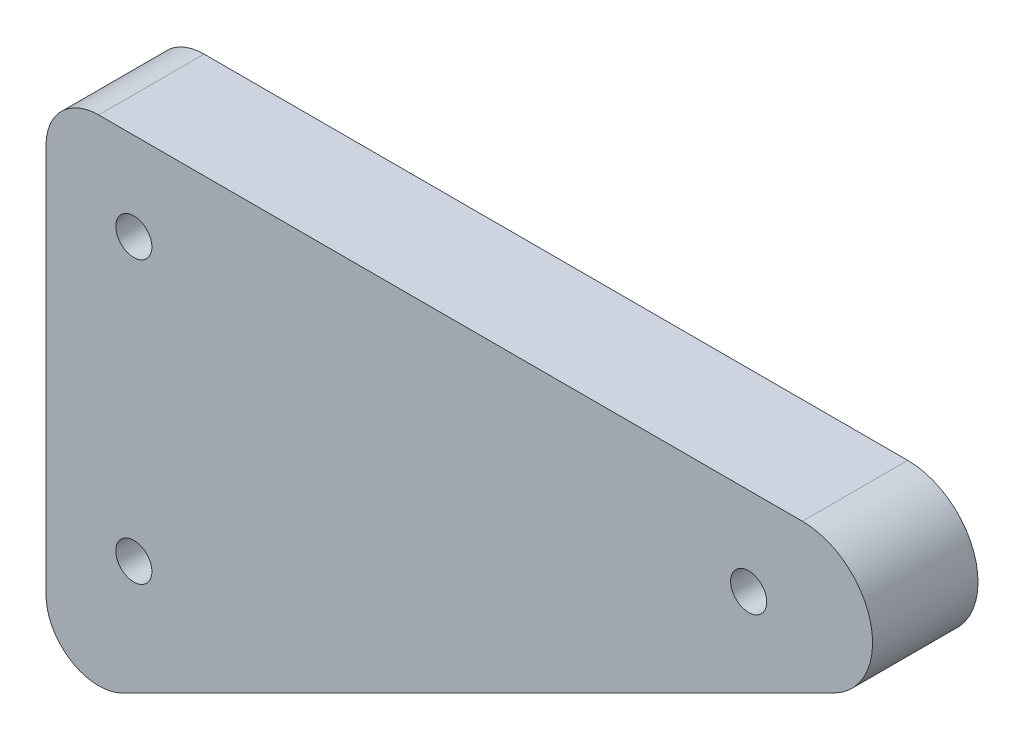
ISO-10303-21;
HEADER;
FILE_DESCRIPTION(('STEP AP214'),'2;1');
FILE_NAME('part.step','',(''),(''),'','','');
FILE_SCHEMA(('AUTOMOTIVE_DESIGN { 1 0 10303 214 1 1 1 1 }'));
ENDSEC;
DATA;
#1=APPLICATION_CONTEXT('core data for automotive mechanical design processes');
#2=APPLICATION_PROTOCOL_DEFINITION('international standard','automotive_design',2000,#1);
#3=PRODUCT_CONTEXT('',#1,'mechanical');
#4=PRODUCT('Part','Part','',(#3));
#5=PRODUCT_RELATED_PRODUCT_CATEGORY('part','',(#4));
#6=PRODUCT_DEFINITION_FORMATION('','',#4);
#7=PRODUCT_DEFINITION_CONTEXT('part definition',#1,'design');
#8=PRODUCT_DEFINITION('design','',#6,#7);
#9=PRODUCT_DEFINITION_SHAPE('','',#8);
#10=(LENGTH_UNIT() NAMED_UNIT(*) SI_UNIT(.MILLI.,.METRE.));
#11=(NAMED_UNIT(*) PLANE_ANGLE_UNIT() SI_UNIT($,.RADIAN.));
#12=(NAMED_UNIT(*) SI_UNIT($,.STERADIAN.) SOLID_ANGLE_UNIT());
#13=UNCERTAINTY_MEASURE_WITH_UNIT(LENGTH_MEASURE(1.E-05),#10,'distance_accuracy_value','');
#14=(GEOMETRIC_REPRESENTATION_CONTEXT(3) GLOBAL_UNCERTAINTY_ASSIGNED_CONTEXT((#13)) GLOBAL_UNIT_ASSIGNED_CONTEXT((#10,
#11,#12)) REPRESENTATION_CONTEXT('',''));
#15=CARTESIAN_POINT('',(0.,0.,0.));
#16=DIRECTION('',(0.,0.,1.));
#17=DIRECTION('',(1.,0.,0.));
#18=AXIS2_PLACEMENT_3D('',#15,#16,#17);
#19=CARTESIAN_POINT('',(95.25,0.,4.7625));
#20=DIRECTION('',(0.,-1.,0.));
#21=DIRECTION('',(0.,0.,-1.));
#22=AXIS2_PLACEMENT_3D('',#19,#20,#21);
#23=PLANE('',#22);
#24=DIRECTION('',(-1.,0.,0.));
#25=VECTOR('',#24,1.);
#26=CARTESIAN_POINT('',(95.25,0.,4.7625));
#27=LINE('',#26,#25);
#28=CARTESIAN_POINT('',(68.3509683428764,0.,4.7625));
#29=VERTEX_POINT('',#28);
#30=CARTESIAN_POINT('',(4.7625,0.,4.7625));
#31=VERTEX_POINT('',#30);
#32=EDGE_CURVE('E102',#29,#31,#27,.T.);
#33=ORIENTED_EDGE('',*,*,#32,.F.);
#34=DIRECTION('',(0.,0.,-1.));
#35=VECTOR('',#34,1.);
#36=CARTESIAN_POINT('',(68.3509683428764,0.,4.7625));
#37=LINE('',#36,#35);
#38=CARTESIAN_POINT('',(68.3509683428764,0.,-4.7625));
#39=VERTEX_POINT('',#38);
#40=EDGE_CURVE('E123',#29,#39,#37,.T.);
#41=ORIENTED_EDGE('',*,*,#40,.T.);
#42=DIRECTION('',(-1.,0.,0.));
#43=VECTOR('',#42,1.);
#44=CARTESIAN_POINT('',(95.25,0.,-4.7625));
#45=LINE('',#44,#43);
#46=CARTESIAN_POINT('',(4.7625,0.,-4.7625));
#47=VERTEX_POINT('',#46);
#48=EDGE_CURVE('E107',#39,#47,#45,.T.);
#49=ORIENTED_EDGE('',*,*,#48,.T.);
#50=DIRECTION('',(0.,0.,-1.));
#51=VECTOR('',#50,1.);
#52=CARTESIAN_POINT('',(4.7625,0.,4.7625));
#53=LINE('',#52,#51);
#54=EDGE_CURVE('E120',#47,#31,#53,.F.);
#55=ORIENTED_EDGE('',*,*,#54,.T.);
#56=EDGE_LOOP('',(#33,#41,#49,#55));
#57=FACE_BOUND('',#56,.T.);
#58=ADVANCED_FACE('F33',(#57),#23,.F.);
#59=CARTESIAN_POINT('',(0.,0.,4.7625));
#60=DIRECTION('',(1.,0.,0.));
#61=DIRECTION('',(0.,0.,-1.));
#62=AXIS2_PLACEMENT_3D('',#59,#60,#61);
#63=PLANE('',#62);
#64=DIRECTION('',(0.,-1.,0.));
#65=VECTOR('',#64,1.);
#66=CARTESIAN_POINT('',(0.,0.,-4.7625));
#67=LINE('',#66,#65);
#68=CARTESIAN_POINT('',(0.,-4.7625,-4.7625));
#69=VERTEX_POINT('',#68);
#70=CARTESIAN_POINT('',(0.,-39.9191131285786,-4.7625));
#71=VERTEX_POINT('',#70);
#72=EDGE_CURVE('E103',#69,#71,#67,.T.);
#73=ORIENTED_EDGE('',*,*,#72,.T.);
#74=DIRECTION('',(0.,0.,-1.));
#75=VECTOR('',#74,1.);
#76=CARTESIAN_POINT('',(0.,-39.9191131285786,4.7625));
#77=LINE('',#76,#75);
#78=CARTESIAN_POINT('',(0.,-39.9191131285786,4.7625));
#79=VERTEX_POINT('',#78);
#80=EDGE_CURVE('E91',#71,#79,#77,.F.);
#81=ORIENTED_EDGE('',*,*,#80,.T.);
#82=DIRECTION('',(0.,-1.,0.));
#83=VECTOR('',#82,1.);
#84=CARTESIAN_POINT('',(0.,0.,4.7625));
#85=LINE('',#84,#83);
#86=CARTESIAN_POINT('',(0.,-4.7625,4.7625));
#87=VERTEX_POINT('',#86);
#88=EDGE_CURVE('E105',#87,#79,#85,.T.);
#89=ORIENTED_EDGE('',*,*,#88,.F.);
#90=DIRECTION('',(0.,0.,-1.));
#91=VECTOR('',#90,1.);
#92=CARTESIAN_POINT('',(0.,-4.7625,4.7625));
#93=LINE('',#92,#91);
#94=EDGE_CURVE('E94',#87,#69,#93,.T.);
#95=ORIENTED_EDGE('',*,*,#94,.T.);
#96=EDGE_LOOP('',(#73,#81,#89,#95));
#97=FACE_BOUND('',#96,.T.);
#98=ADVANCED_FACE('F173',(#97),#63,.F.);
#99=CARTESIAN_POINT('',(0.,-47.625,4.7625));
#100=DIRECTION('',(-0.447213595499958,0.894427190999916,0.));
#101=DIRECTION('',(-0.894427190999916,-0.447213595499958,0.));
#102=AXIS2_PLACEMENT_3D('',#99,#100,#101);
#103=PLANE('',#102);
#104=DIRECTION('',(0.894427190999916,0.447213595499958,0.));
#105=VECTOR('',#104,1.);
#106=CARTESIAN_POINT('',(0.,-47.625,-4.7625));
#107=LINE('',#106,#105);
#108=CARTESIAN_POINT('',(6.89235474856855,-44.1788226257157,-4.7625));
#109=VERTEX_POINT('',#108);
#110=CARTESIAN_POINT('',(71.1907746743011,-12.0296126628495,-4.7625));
#111=VERTEX_POINT('',#110);
#112=EDGE_CURVE('E98',#109,#111,#107,.T.);
#113=ORIENTED_EDGE('',*,*,#112,.T.);
#114=DIRECTION('',(0.,0.,-1.));
#115=VECTOR('',#114,1.);
#116=CARTESIAN_POINT('',(71.1907746743011,-12.0296126628495,4.7625));
#117=LINE('',#116,#115);
#118=CARTESIAN_POINT('',(71.1907746743011,-12.0296126628495,4.7625));
#119=VERTEX_POINT('',#118);
#120=EDGE_CURVE('E41',#111,#119,#117,.F.);
#121=ORIENTED_EDGE('',*,*,#120,.T.);
#122=DIRECTION('',(0.894427190999916,0.447213595499958,0.));
#123=VECTOR('',#122,1.);
#124=CARTESIAN_POINT('',(0.,-47.625,4.7625));
#125=LINE('',#124,#123);
#126=CARTESIAN_POINT('',(6.89235474856855,-44.1788226257157,4.7625));
#127=VERTEX_POINT('',#126);
#128=EDGE_CURVE('E99',#127,#119,#125,.T.);
#129=ORIENTED_EDGE('',*,*,#128,.F.);
#130=DIRECTION('',(0.,0.,-1.));
#131=VECTOR('',#130,1.);
#132=CARTESIAN_POINT('',(6.89235474856855,-44.1788226257157,4.7625));
#133=LINE('',#132,#131);
#134=EDGE_CURVE('E90',#127,#109,#133,.T.);
#135=ORIENTED_EDGE('',*,*,#134,.T.);
#136=EDGE_LOOP('',(#113,#121,#129,#135));
#137=FACE_BOUND('',#136,.T.);
#138=ADVANCED_FACE('F97',(#137),#103,.F.);
#139=CARTESIAN_POINT('',(0.,0.,4.7625));
#140=DIRECTION('',(0.,0.,1.));
#141=DIRECTION('',(1.,0.,0.));
#142=AXIS2_PLACEMENT_3D('',#139,#140,#141);
#143=PLANE('',#142);
#144=CARTESIAN_POINT('',(7.9375,-7.9375,4.7625));
#145=DIRECTION('',(0.,0.,1.));
#146=DIRECTION('',(1.,0.,0.));
#147=AXIS2_PLACEMENT_3D('',#144,#145,#146);
#148=CIRCLE('',#147,1.63195);
#149=CARTESIAN_POINT('',(9.56945,-7.9375,4.7625));
#150=VERTEX_POINT('',#149);
#151=EDGE_CURVE('E151',#150,#150,#148,.T.);
#152=ORIENTED_EDGE('',*,*,#151,.F.);
#153=EDGE_LOOP('',(#152));
#154=FACE_BOUND('',#153,.T.);
#155=CARTESIAN_POINT('',(63.5,-7.9375,4.7625));
#156=DIRECTION('',(0.,0.,1.));
#157=DIRECTION('',(1.,0.,0.));
#158=AXIS2_PLACEMENT_3D('',#155,#156,#157);
#159=CIRCLE('',#158,1.63194999999999);
#160=CARTESIAN_POINT('',(65.13195,-7.9375,4.7625));
#161=VERTEX_POINT('',#160);
#162=EDGE_CURVE('E145',#161,#161,#159,.T.);
#163=ORIENTED_EDGE('',*,*,#162,.F.);
#164=EDGE_LOOP('',(#163));
#165=FACE_BOUND('',#164,.T.);
#166=CARTESIAN_POINT('',(7.9375,-33.3375,4.7625));
#167=DIRECTION('',(0.,0.,1.));
#168=DIRECTION('',(1.,0.,0.));
#169=AXIS2_PLACEMENT_3D('',#166,#167,#168);
#170=CIRCLE('',#169,1.63195);
#171=CARTESIAN_POINT('',(9.56945,-33.3375,4.7625));
#172=VERTEX_POINT('',#171);
#173=EDGE_CURVE('E134',#172,#172,#170,.T.);
#174=ORIENTED_EDGE('',*,*,#173,.F.);
#175=EDGE_LOOP('',(#174));
#176=FACE_BOUND('',#175,.T.);
#177=ORIENTED_EDGE('',*,*,#128,.T.);
#178=CARTESIAN_POINT('',(68.3509683428764,-6.35,4.7625));
#179=DIRECTION('',(0.,0.,1.));
#180=DIRECTION('',(1.,0.,0.));
#181=AXIS2_PLACEMENT_3D('',#178,#179,#180);
#182=CIRCLE('',#181,6.35);
#183=EDGE_CURVE('E11',#119,#29,#182,.T.);
#184=ORIENTED_EDGE('',*,*,#183,.T.);
#185=ORIENTED_EDGE('',*,*,#32,.T.);
#186=CARTESIAN_POINT('',(4.7625,-4.7625,4.7625));
#187=DIRECTION('',(0.,0.,1.));
#188=DIRECTION('',(1.,0.,0.));
#189=AXIS2_PLACEMENT_3D('',#186,#187,#188);
#190=CIRCLE('',#189,4.7625);
#191=EDGE_CURVE('E116',#31,#87,#190,.T.);
#192=ORIENTED_EDGE('',*,*,#191,.T.);
#193=ORIENTED_EDGE('',*,*,#88,.T.);
#194=CARTESIAN_POINT('',(4.7625,-39.9191131285786,4.7625));
#195=DIRECTION('',(0.,0.,1.));
#196=DIRECTION('',(1.,0.,0.));
#197=AXIS2_PLACEMENT_3D('',#194,#195,#196);
#198=CIRCLE('',#197,4.7625);
#199=EDGE_CURVE('E118',#79,#127,#198,.T.);
#200=ORIENTED_EDGE('',*,*,#199,.T.);
#201=EDGE_LOOP('',(#177,#184,#185,#192,#193,#200));
#202=FACE_BOUND('',#201,.T.);
#203=ADVANCED_FACE('F158',(#154,#165,#176,#202),#143,.T.);
#204=CARTESIAN_POINT('',(0.,0.,-4.7625));
#205=DIRECTION('',(0.,0.,1.));
#206=DIRECTION('',(1.,0.,0.));
#207=AXIS2_PLACEMENT_3D('',#204,#205,#206);
#208=PLANE('',#207);
#209=CARTESIAN_POINT('',(7.9375,-7.9375,-4.7625));
#210=DIRECTION('',(0.,0.,1.));
#211=DIRECTION('',(1.,0.,0.));
#212=AXIS2_PLACEMENT_3D('',#209,#210,#211);
#213=CIRCLE('',#212,1.63195);
#214=CARTESIAN_POINT('',(9.56945,-7.9375,-4.7625));
#215=VERTEX_POINT('',#214);
#216=EDGE_CURVE('E148',#215,#215,#213,.T.);
#217=ORIENTED_EDGE('',*,*,#216,.T.);
#218=EDGE_LOOP('',(#217));
#219=FACE_BOUND('',#218,.T.);
#220=CARTESIAN_POINT('',(63.5,-7.9375,-4.7625));
#221=DIRECTION('',(0.,0.,1.));
#222=DIRECTION('',(1.,0.,0.));
#223=AXIS2_PLACEMENT_3D('',#220,#221,#222);
#224=CIRCLE('',#223,1.63194999999999);
#225=CARTESIAN_POINT('',(65.13195,-7.9375,-4.7625));
#226=VERTEX_POINT('',#225);
#227=EDGE_CURVE('E142',#226,#226,#224,.T.);
#228=ORIENTED_EDGE('',*,*,#227,.T.);
#229=EDGE_LOOP('',(#228));
#230=FACE_BOUND('',#229,.T.);
#231=CARTESIAN_POINT('',(7.9375,-33.3375,-4.7625));
#232=DIRECTION('',(0.,0.,1.));
#233=DIRECTION('',(1.,0.,0.));
#234=AXIS2_PLACEMENT_3D('',#231,#232,#233);
#235=CIRCLE('',#234,1.63195);
#236=CARTESIAN_POINT('',(9.56945,-33.3375,-4.7625));
#237=VERTEX_POINT('',#236);
#238=EDGE_CURVE('E132',#237,#237,#235,.T.);
#239=ORIENTED_EDGE('',*,*,#238,.T.);
#240=EDGE_LOOP('',(#239));
#241=FACE_BOUND('',#240,.T.);
#242=ORIENTED_EDGE('',*,*,#48,.F.);
#243=CARTESIAN_POINT('',(68.3509683428764,-6.35,-4.7625));
#244=DIRECTION('',(0.,0.,1.));
#245=DIRECTION('',(1.,0.,0.));
#246=AXIS2_PLACEMENT_3D('',#243,#244,#245);
#247=CIRCLE('',#246,6.35);
#248=EDGE_CURVE('E55',#39,#111,#247,.F.);
#249=ORIENTED_EDGE('',*,*,#248,.T.);
#250=ORIENTED_EDGE('',*,*,#112,.F.);
#251=CARTESIAN_POINT('',(4.7625,-39.9191131285786,-4.7625));
#252=DIRECTION('',(0.,0.,1.));
#253=DIRECTION('',(1.,0.,0.));
#254=AXIS2_PLACEMENT_3D('',#251,#252,#253);
#255=CIRCLE('',#254,4.7625);
#256=EDGE_CURVE('E86',#109,#71,#255,.F.);
#257=ORIENTED_EDGE('',*,*,#256,.T.);
#258=ORIENTED_EDGE('',*,*,#72,.F.);
#259=CARTESIAN_POINT('',(4.7625,-4.7625,-4.7625));
#260=DIRECTION('',(0.,0.,1.));
#261=DIRECTION('',(1.,0.,0.));
#262=AXIS2_PLACEMENT_3D('',#259,#260,#261);
#263=CIRCLE('',#262,4.7625);
#264=EDGE_CURVE('E95',#69,#47,#263,.F.);
#265=ORIENTED_EDGE('',*,*,#264,.T.);
#266=EDGE_LOOP('',(#242,#249,#250,#257,#258,#265));
#267=FACE_BOUND('',#266,.T.);
#268=ADVANCED_FACE('F101',(#219,#230,#241,#267),#208,.F.);
#269=CARTESIAN_POINT('',(7.9375,-33.3375,4.7625));
#270=DIRECTION('',(0.,0.,1.));
#271=DIRECTION('',(1.,0.,0.));
#272=AXIS2_PLACEMENT_3D('',#269,#270,#271);
#273=CYLINDRICAL_SURFACE('',#272,1.63195);
#274=ORIENTED_EDGE('',*,*,#173,.T.);
#275=EDGE_LOOP('',(#274));
#276=FACE_BOUND('',#275,.T.);
#277=ORIENTED_EDGE('',*,*,#238,.F.);
#278=EDGE_LOOP('',(#277));
#279=FACE_BOUND('',#278,.T.);
#280=ADVANCED_FACE('F191',(#276,#279),#273,.F.);
#281=CARTESIAN_POINT('',(63.5,-7.9375,4.7625));
#282=DIRECTION('',(0.,0.,1.));
#283=DIRECTION('',(1.,0.,0.));
#284=AXIS2_PLACEMENT_3D('',#281,#282,#283);
#285=CYLINDRICAL_SURFACE('',#284,1.63194999999999);
#286=ORIENTED_EDGE('',*,*,#162,.T.);
#287=EDGE_LOOP('',(#286));
#288=FACE_BOUND('',#287,.T.);
#289=ORIENTED_EDGE('',*,*,#227,.F.);
#290=EDGE_LOOP('',(#289));
#291=FACE_BOUND('',#290,.T.);
#292=ADVANCED_FACE('F186',(#288,#291),#285,.F.);
#293=CARTESIAN_POINT('',(7.9375,-7.9375,4.7625));
#294=DIRECTION('',(0.,0.,1.));
#295=DIRECTION('',(1.,0.,0.));
#296=AXIS2_PLACEMENT_3D('',#293,#294,#295);
#297=CYLINDRICAL_SURFACE('',#296,1.63195);
#298=ORIENTED_EDGE('',*,*,#151,.T.);
#299=EDGE_LOOP('',(#298));
#300=FACE_BOUND('',#299,.T.);
#301=ORIENTED_EDGE('',*,*,#216,.F.);
#302=EDGE_LOOP('',(#301));
#303=FACE_BOUND('',#302,.T.);
#304=ADVANCED_FACE('F155',(#300,#303),#297,.F.);
#305=CARTESIAN_POINT('',(4.7625,-39.9191131285786,4.7625));
#306=DIRECTION('',(0.,0.,-1.));
#307=DIRECTION('',(-1.,0.,0.));
#308=AXIS2_PLACEMENT_3D('',#305,#306,#307);
#309=CYLINDRICAL_SURFACE('',#308,4.7625);
#310=ORIENTED_EDGE('',*,*,#199,.F.);
#311=ORIENTED_EDGE('',*,*,#80,.F.);
#312=ORIENTED_EDGE('',*,*,#256,.F.);
#313=ORIENTED_EDGE('',*,*,#134,.F.);
#314=EDGE_LOOP('',(#310,#311,#312,#313));
#315=FACE_BOUND('',#314,.T.);
#316=ADVANCED_FACE('F89',(#315),#309,.T.);
#317=CARTESIAN_POINT('',(4.7625,-4.7625,4.7625));
#318=DIRECTION('',(0.,0.,-1.));
#319=DIRECTION('',(-1.,0.,0.));
#320=AXIS2_PLACEMENT_3D('',#317,#318,#319);
#321=CYLINDRICAL_SURFACE('',#320,4.7625);
#322=ORIENTED_EDGE('',*,*,#191,.F.);
#323=ORIENTED_EDGE('',*,*,#54,.F.);
#324=ORIENTED_EDGE('',*,*,#264,.F.);
#325=ORIENTED_EDGE('',*,*,#94,.F.);
#326=EDGE_LOOP('',(#322,#323,#324,#325));
#327=FACE_BOUND('',#326,.T.);
#328=ADVANCED_FACE('F167',(#327),#321,.T.);
#329=CARTESIAN_POINT('',(68.3509683428764,-6.35,4.7625));
#330=DIRECTION('',(0.,0.,-1.));
#331=DIRECTION('',(-1.,0.,0.));
#332=AXIS2_PLACEMENT_3D('',#329,#330,#331);
#333=CYLINDRICAL_SURFACE('',#332,6.35);
#334=ORIENTED_EDGE('',*,*,#183,.F.);
#335=ORIENTED_EDGE('',*,*,#120,.F.);
#336=ORIENTED_EDGE('',*,*,#248,.F.);
#337=ORIENTED_EDGE('',*,*,#40,.F.);
#338=EDGE_LOOP('',(#334,#335,#336,#337));
#339=FACE_BOUND('',#338,.T.);
#340=ADVANCED_FACE('F35',(#339),#333,.T.);
#341=CLOSED_SHELL('',(#58,#98,#138,#203,#268,#280,#292,#304,#316,#328,#340));
#342=MANIFOLD_SOLID_BREP('B2',#341);
#343=ADVANCED_BREP_SHAPE_REPRESENTATION('',(#18,#342),#14);
#344=SHAPE_DEFINITION_REPRESENTATION(#9,#343);
ENDSEC;
END-ISO-10303-21;
